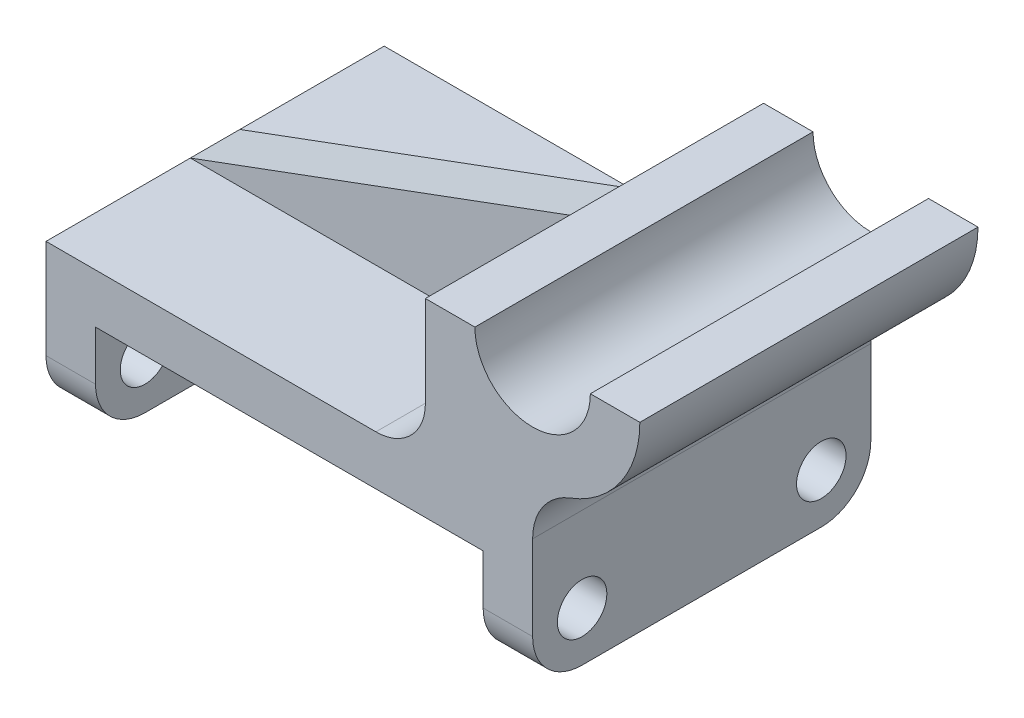
ISO-10303-21;
HEADER;
FILE_DESCRIPTION(('STEP AP214'),'2;1');
FILE_NAME('part.step','',(''),(''),'','','');
FILE_SCHEMA(('AUTOMOTIVE_DESIGN { 1 0 10303 214 1 1 1 1 }'));
ENDSEC;
DATA;
#1=APPLICATION_CONTEXT('core data for automotive mechanical design processes');
#2=APPLICATION_PROTOCOL_DEFINITION('international standard','automotive_design',2000,#1);
#3=PRODUCT_CONTEXT('',#1,'mechanical');
#4=PRODUCT('Part','Part','',(#3));
#5=PRODUCT_RELATED_PRODUCT_CATEGORY('part','',(#4));
#6=PRODUCT_DEFINITION_FORMATION('','',#4);
#7=PRODUCT_DEFINITION_CONTEXT('part definition',#1,'design');
#8=PRODUCT_DEFINITION('design','',#6,#7);
#9=PRODUCT_DEFINITION_SHAPE('','',#8);
#10=(LENGTH_UNIT() NAMED_UNIT(*) SI_UNIT(.MILLI.,.METRE.));
#11=(NAMED_UNIT(*) PLANE_ANGLE_UNIT() SI_UNIT($,.RADIAN.));
#12=(NAMED_UNIT(*) SI_UNIT($,.STERADIAN.) SOLID_ANGLE_UNIT());
#13=UNCERTAINTY_MEASURE_WITH_UNIT(LENGTH_MEASURE(1.E-05),#10,'distance_accuracy_value','');
#14=(GEOMETRIC_REPRESENTATION_CONTEXT(3) GLOBAL_UNCERTAINTY_ASSIGNED_CONTEXT((#13)) GLOBAL_UNIT_ASSIGNED_CONTEXT((#10,
#11,#12)) REPRESENTATION_CONTEXT('',''));
#15=CARTESIAN_POINT('',(0.,0.,0.));
#16=DIRECTION('',(0.,0.,1.));
#17=DIRECTION('',(1.,0.,0.));
#18=AXIS2_PLACEMENT_3D('',#15,#16,#17);
#19=CARTESIAN_POINT('',(92.,0.,41.));
#20=DIRECTION('',(1.,0.,0.));
#21=DIRECTION('',(0.,1.,0.));
#22=AXIS2_PLACEMENT_3D('',#19,#20,#21);
#23=PLANE('',#22);
#24=DIRECTION('',(0.,-1.,0.));
#25=VECTOR('',#24,1.);
#26=CARTESIAN_POINT('',(92.,0.,-6.));
#27=LINE('',#26,#25);
#28=CARTESIAN_POINT('',(92.,41.1151832460733,-6.));
#29=VERTEX_POINT('',#28);
#30=CARTESIAN_POINT('',(92.,19.1151832460733,-6.));
#31=VERTEX_POINT('',#30);
#32=EDGE_CURVE('E349',#29,#31,#27,.T.);
#33=ORIENTED_EDGE('',*,*,#32,.F.);
#34=DIRECTION('',(0.,0.,-1.));
#35=VECTOR('',#34,1.);
#36=CARTESIAN_POINT('',(92.,41.1151832460733,41.));
#37=LINE('',#36,#35);
#38=CARTESIAN_POINT('',(92.,41.1151832460733,-41.));
#39=VERTEX_POINT('',#38);
#40=EDGE_CURVE('E236',#29,#39,#37,.T.);
#41=ORIENTED_EDGE('',*,*,#40,.T.);
#42=DIRECTION('',(0.,-1.,0.));
#43=VECTOR('',#42,1.);
#44=CARTESIAN_POINT('',(92.,0.,-41.));
#45=LINE('',#44,#43);
#46=CARTESIAN_POINT('',(92.,19.1151832460733,-41.));
#47=VERTEX_POINT('',#46);
#48=EDGE_CURVE('E347',#39,#47,#45,.T.);
#49=ORIENTED_EDGE('',*,*,#48,.T.);
#50=DIRECTION('',(0.,0.,-1.));
#51=VECTOR('',#50,1.);
#52=CARTESIAN_POINT('',(92.,19.1151832460733,41.));
#53=LINE('',#52,#51);
#54=EDGE_CURVE('E224',#31,#47,#53,.T.);
#55=ORIENTED_EDGE('',*,*,#54,.F.);
#56=EDGE_LOOP('',(#33,#41,#49,#55));
#57=FACE_BOUND('',#56,.T.);
#58=ADVANCED_FACE('F38',(#57),#23,.F.);
#59=CARTESIAN_POINT('',(80.,19.1151832460733,41.));
#60=DIRECTION('',(0.,0.,-1.));
#61=DIRECTION('',(-1.,0.,0.));
#62=AXIS2_PLACEMENT_3D('',#59,#60,#61);
#63=CYLINDRICAL_SURFACE('',#62,12.);
#64=DIRECTION('',(0.,0.,-1.));
#65=VECTOR('',#64,1.);
#66=CARTESIAN_POINT('',(80.,7.1151832460733,41.));
#67=LINE('',#66,#65);
#68=CARTESIAN_POINT('',(80.,7.1151832460733,-6.));
#69=VERTEX_POINT('',#68);
#70=CARTESIAN_POINT('',(80.,7.1151832460733,-41.));
#71=VERTEX_POINT('',#70);
#72=EDGE_CURVE('E225',#69,#71,#67,.T.);
#73=ORIENTED_EDGE('',*,*,#72,.F.);
#74=CARTESIAN_POINT('',(80.,19.1151832460733,-6.));
#75=DIRECTION('',(0.,0.,1.));
#76=DIRECTION('',(1.,0.,0.));
#77=AXIS2_PLACEMENT_3D('',#74,#75,#76);
#78=CIRCLE('',#77,12.);
#79=EDGE_CURVE('E532',#69,#31,#78,.T.);
#80=ORIENTED_EDGE('',*,*,#79,.T.);
#81=ORIENTED_EDGE('',*,*,#54,.T.);
#82=CARTESIAN_POINT('',(80.,19.1151832460733,-41.));
#83=DIRECTION('',(0.,0.,1.));
#84=DIRECTION('',(1.,0.,0.));
#85=AXIS2_PLACEMENT_3D('',#82,#83,#84);
#86=CIRCLE('',#85,12.);
#87=EDGE_CURVE('E361',#71,#47,#86,.T.);
#88=ORIENTED_EDGE('',*,*,#87,.F.);
#89=EDGE_LOOP('',(#73,#80,#81,#88));
#90=FACE_BOUND('',#89,.T.);
#91=ADVANCED_FACE('F531',(#90),#63,.F.);
#92=CARTESIAN_POINT('',(0.,7.1151832460733,41.));
#93=DIRECTION('',(0.,1.,0.));
#94=DIRECTION('',(0.,0.,1.));
#95=AXIS2_PLACEMENT_3D('',#92,#93,#94);
#96=PLANE('',#95);
#97=DIRECTION('',(0.,0.,-1.));
#98=VECTOR('',#97,1.);
#99=CARTESIAN_POINT('',(0.,7.1151832460733,41.));
#100=LINE('',#99,#98);
#101=CARTESIAN_POINT('',(0.,7.1151832460733,-6.));
#102=VERTEX_POINT('',#101);
#103=CARTESIAN_POINT('',(0.,7.1151832460733,-41.));
#104=VERTEX_POINT('',#103);
#105=EDGE_CURVE('E415',#102,#104,#100,.T.);
#106=ORIENTED_EDGE('',*,*,#105,.F.);
#107=DIRECTION('',(1.,0.,0.));
#108=VECTOR('',#107,1.);
#109=CARTESIAN_POINT('',(0.,7.1151832460733,-6.));
#110=LINE('',#109,#108);
#111=EDGE_CURVE('E528',#102,#69,#110,.T.);
#112=ORIENTED_EDGE('',*,*,#111,.T.);
#113=ORIENTED_EDGE('',*,*,#72,.T.);
#114=DIRECTION('',(1.,0.,0.));
#115=VECTOR('',#114,1.);
#116=CARTESIAN_POINT('',(0.,7.1151832460733,-41.));
#117=LINE('',#116,#115);
#118=EDGE_CURVE('E378',#104,#71,#117,.T.);
#119=ORIENTED_EDGE('',*,*,#118,.F.);
#120=EDGE_LOOP('',(#106,#112,#113,#119));
#121=FACE_BOUND('',#120,.T.);
#122=ADVANCED_FACE('F524',(#121),#96,.T.);
#123=CARTESIAN_POINT('',(118.,0.,41.));
#124=DIRECTION('',(-1.,0.,0.));
#125=DIRECTION('',(0.,0.,1.));
#126=AXIS2_PLACEMENT_3D('',#123,#124,#125);
#127=PLANE('',#126);
#128=CARTESIAN_POINT('',(118.,-16.8848167539267,29.));
#129=DIRECTION('',(-1.,0.,0.));
#130=DIRECTION('',(0.,0.,1.));
#131=AXIS2_PLACEMENT_3D('',#128,#129,#130);
#132=CIRCLE('',#131,6.);
#133=CARTESIAN_POINT('',(118.,-16.8848167539267,35.));
#134=VERTEX_POINT('',#133);
#135=EDGE_CURVE('E540',#134,#134,#132,.T.);
#136=ORIENTED_EDGE('',*,*,#135,.T.);
#137=EDGE_LOOP('',(#136));
#138=FACE_BOUND('',#137,.T.);
#139=CARTESIAN_POINT('',(118.,-16.8848167539267,-29.));
#140=DIRECTION('',(-1.,0.,0.));
#141=DIRECTION('',(0.,0.,1.));
#142=AXIS2_PLACEMENT_3D('',#139,#140,#141);
#143=CIRCLE('',#142,6.);
#144=CARTESIAN_POINT('',(118.,-16.8848167539267,-23.));
#145=VERTEX_POINT('',#144);
#146=EDGE_CURVE('E270',#145,#145,#143,.T.);
#147=ORIENTED_EDGE('',*,*,#146,.T.);
#148=EDGE_LOOP('',(#147));
#149=FACE_BOUND('',#148,.T.);
#150=DIRECTION('',(0.,0.,-1.));
#151=VECTOR('',#150,1.);
#152=CARTESIAN_POINT('',(118.,-28.8848167539267,41.));
#153=LINE('',#152,#151);
#154=CARTESIAN_POINT('',(118.,-28.8848167539267,29.));
#155=VERTEX_POINT('',#154);
#156=CARTESIAN_POINT('',(118.,-28.8848167539267,-29.));
#157=VERTEX_POINT('',#156);
#158=EDGE_CURVE('E395',#155,#157,#153,.T.);
#159=ORIENTED_EDGE('',*,*,#158,.T.);
#160=CARTESIAN_POINT('',(118.,-16.8848167539267,-29.));
#161=DIRECTION('',(-1.,0.,0.));
#162=DIRECTION('',(0.,0.,1.));
#163=AXIS2_PLACEMENT_3D('',#160,#161,#162);
#164=CIRCLE('',#163,12.);
#165=CARTESIAN_POINT('',(118.,-16.8848167539267,-41.));
#166=VERTEX_POINT('',#165);
#167=EDGE_CURVE('E11',#157,#166,#164,.F.);
#168=ORIENTED_EDGE('',*,*,#167,.T.);
#169=DIRECTION('',(0.,1.,0.));
#170=VECTOR('',#169,1.);
#171=CARTESIAN_POINT('',(118.,0.,-41.));
#172=LINE('',#171,#170);
#173=CARTESIAN_POINT('',(118.,3.64519525568294,-41.));
#174=VERTEX_POINT('',#173);
#175=EDGE_CURVE('E458',#166,#174,#172,.T.);
#176=ORIENTED_EDGE('',*,*,#175,.T.);
#177=DIRECTION('',(0.,0.,-1.));
#178=VECTOR('',#177,1.);
#179=CARTESIAN_POINT('',(118.,3.64519525568294,41.));
#180=LINE('',#179,#178);
#181=CARTESIAN_POINT('',(118.,3.64519525568294,41.));
#182=VERTEX_POINT('',#181);
#183=EDGE_CURVE('E254',#182,#174,#180,.T.);
#184=ORIENTED_EDGE('',*,*,#183,.F.);
#185=DIRECTION('',(0.,1.,0.));
#186=VECTOR('',#185,1.);
#187=CARTESIAN_POINT('',(118.,0.,41.));
#188=LINE('',#187,#186);
#189=CARTESIAN_POINT('',(118.,-16.8848167539267,41.));
#190=VERTEX_POINT('',#189);
#191=EDGE_CURVE('E394',#190,#182,#188,.T.);
#192=ORIENTED_EDGE('',*,*,#191,.F.);
#193=CARTESIAN_POINT('',(118.,-16.8848167539267,29.));
#194=DIRECTION('',(-1.,0.,0.));
#195=DIRECTION('',(0.,0.,1.));
#196=AXIS2_PLACEMENT_3D('',#193,#194,#195);
#197=CIRCLE('',#196,12.);
#198=EDGE_CURVE('E47',#190,#155,#197,.F.);
#199=ORIENTED_EDGE('',*,*,#198,.T.);
#200=EDGE_LOOP('',(#159,#168,#176,#184,#192,#199));
#201=FACE_BOUND('',#200,.T.);
#202=ADVANCED_FACE('F641',(#138,#149,#201),#127,.F.);
#203=CARTESIAN_POINT('',(132.,3.64519525568294,41.));
#204=DIRECTION('',(0.,0.,-1.));
#205=DIRECTION('',(-1.,0.,0.));
#206=AXIS2_PLACEMENT_3D('',#203,#204,#205);
#207=CYLINDRICAL_SURFACE('',#206,14.);
#208=CARTESIAN_POINT('',(132.,3.64519525568294,-41.));
#209=DIRECTION('',(0.,0.,1.));
#210=DIRECTION('',(1.,0.,0.));
#211=AXIS2_PLACEMENT_3D('',#208,#209,#210);
#212=CIRCLE('',#211,14.);
#213=CARTESIAN_POINT('',(127.1,16.7596910523196,-41.));
#214=VERTEX_POINT('',#213);
#215=EDGE_CURVE('E461',#174,#214,#212,.F.);
#216=ORIENTED_EDGE('',*,*,#215,.T.);
#217=DIRECTION('',(0.,0.,-1.));
#218=VECTOR('',#217,1.);
#219=CARTESIAN_POINT('',(127.1,16.7596910523196,41.));
#220=LINE('',#219,#218);
#221=CARTESIAN_POINT('',(127.1,16.7596910523196,41.));
#222=VERTEX_POINT('',#221);
#223=EDGE_CURVE('E250',#222,#214,#220,.T.);
#224=ORIENTED_EDGE('',*,*,#223,.F.);
#225=CARTESIAN_POINT('',(132.,3.64519525568294,41.));
#226=DIRECTION('',(0.,0.,1.));
#227=DIRECTION('',(1.,0.,0.));
#228=AXIS2_PLACEMENT_3D('',#225,#226,#227);
#229=CIRCLE('',#228,14.);
#230=EDGE_CURVE('E488',#182,#222,#229,.F.);
#231=ORIENTED_EDGE('',*,*,#230,.F.);
#232=ORIENTED_EDGE('',*,*,#183,.T.);
#233=EDGE_LOOP('',(#216,#224,#231,#232));
#234=FACE_BOUND('',#233,.T.);
#235=ADVANCED_FACE('F487',(#234),#207,.F.);
#236=CARTESIAN_POINT('',(118.,41.1151832460733,41.));
#237=DIRECTION('',(0.,0.,-1.));
#238=DIRECTION('',(-1.,0.,0.));
#239=AXIS2_PLACEMENT_3D('',#236,#237,#238);
#240=CYLINDRICAL_SURFACE('',#239,26.);
#241=CARTESIAN_POINT('',(118.,41.1151832460733,-41.));
#242=DIRECTION('',(0.,0.,1.));
#243=DIRECTION('',(1.,0.,0.));
#244=AXIS2_PLACEMENT_3D('',#241,#242,#243);
#245=CIRCLE('',#244,26.);
#246=CARTESIAN_POINT('',(144.,41.1151832460733,-41.));
#247=VERTEX_POINT('',#246);
#248=EDGE_CURVE('E465',#214,#247,#245,.T.);
#249=ORIENTED_EDGE('',*,*,#248,.T.);
#250=DIRECTION('',(0.,0.,-1.));
#251=VECTOR('',#250,1.);
#252=CARTESIAN_POINT('',(144.,41.1151832460733,41.));
#253=LINE('',#252,#251);
#254=CARTESIAN_POINT('',(144.,41.1151832460733,41.));
#255=VERTEX_POINT('',#254);
#256=EDGE_CURVE('E247',#255,#247,#253,.T.);
#257=ORIENTED_EDGE('',*,*,#256,.F.);
#258=CARTESIAN_POINT('',(118.,41.1151832460733,41.));
#259=DIRECTION('',(0.,0.,1.));
#260=DIRECTION('',(1.,0.,0.));
#261=AXIS2_PLACEMENT_3D('',#258,#259,#260);
#262=CIRCLE('',#261,26.);
#263=EDGE_CURVE('E484',#222,#255,#262,.T.);
#264=ORIENTED_EDGE('',*,*,#263,.F.);
#265=ORIENTED_EDGE('',*,*,#223,.T.);
#266=EDGE_LOOP('',(#249,#257,#264,#265));
#267=FACE_BOUND('',#266,.T.);
#268=ADVANCED_FACE('F482',(#267),#240,.T.);
#269=CARTESIAN_POINT('',(0.,41.1151832460733,41.));
#270=DIRECTION('',(0.,1.,0.));
#271=DIRECTION('',(0.,0.,1.));
#272=AXIS2_PLACEMENT_3D('',#269,#270,#271);
#273=PLANE('',#272);
#274=DIRECTION('',(1.,0.,0.));
#275=VECTOR('',#274,1.);
#276=CARTESIAN_POINT('',(0.,41.1151832460733,-41.));
#277=LINE('',#276,#275);
#278=CARTESIAN_POINT('',(132.,41.1151832460733,-41.));
#279=VERTEX_POINT('',#278);
#280=EDGE_CURVE('E372',#279,#247,#277,.T.);
#281=ORIENTED_EDGE('',*,*,#280,.F.);
#282=DIRECTION('',(0.,0.,-1.));
#283=VECTOR('',#282,1.);
#284=CARTESIAN_POINT('',(132.,41.1151832460733,41.));
#285=LINE('',#284,#283);
#286=CARTESIAN_POINT('',(132.,41.1151832460733,41.));
#287=VERTEX_POINT('',#286);
#288=EDGE_CURVE('E244',#287,#279,#285,.T.);
#289=ORIENTED_EDGE('',*,*,#288,.F.);
#290=DIRECTION('',(1.,0.,0.));
#291=VECTOR('',#290,1.);
#292=CARTESIAN_POINT('',(0.,41.1151832460733,41.));
#293=LINE('',#292,#291);
#294=EDGE_CURVE('E479',#287,#255,#293,.T.);
#295=ORIENTED_EDGE('',*,*,#294,.T.);
#296=ORIENTED_EDGE('',*,*,#256,.T.);
#297=EDGE_LOOP('',(#281,#289,#295,#296));
#298=FACE_BOUND('',#297,.T.);
#299=ADVANCED_FACE('F475',(#298),#273,.T.);
#300=CARTESIAN_POINT('',(118.,41.1151832460733,41.));
#301=DIRECTION('',(0.,0.,-1.));
#302=DIRECTION('',(-1.,0.,0.));
#303=AXIS2_PLACEMENT_3D('',#300,#301,#302);
#304=CYLINDRICAL_SURFACE('',#303,14.);
#305=CARTESIAN_POINT('',(118.,41.1151832460733,-41.));
#306=DIRECTION('',(0.,0.,1.));
#307=DIRECTION('',(1.,0.,0.));
#308=AXIS2_PLACEMENT_3D('',#305,#306,#307);
#309=CIRCLE('',#308,14.);
#310=CARTESIAN_POINT('',(104.,41.1151832460733,-41.));
#311=VERTEX_POINT('',#310);
#312=EDGE_CURVE('E368',#311,#279,#309,.T.);
#313=ORIENTED_EDGE('',*,*,#312,.F.);
#314=DIRECTION('',(0.,0.,-1.));
#315=VECTOR('',#314,1.);
#316=CARTESIAN_POINT('',(104.,41.1151832460733,41.));
#317=LINE('',#316,#315);
#318=CARTESIAN_POINT('',(104.,41.1151832460733,41.));
#319=VERTEX_POINT('',#318);
#320=EDGE_CURVE('E241',#319,#311,#317,.T.);
#321=ORIENTED_EDGE('',*,*,#320,.F.);
#322=CARTESIAN_POINT('',(118.,41.1151832460733,41.));
#323=DIRECTION('',(0.,0.,1.));
#324=DIRECTION('',(1.,0.,0.));
#325=AXIS2_PLACEMENT_3D('',#322,#323,#324);
#326=CIRCLE('',#325,14.);
#327=EDGE_CURVE('E559',#319,#287,#326,.T.);
#328=ORIENTED_EDGE('',*,*,#327,.T.);
#329=ORIENTED_EDGE('',*,*,#288,.T.);
#330=EDGE_LOOP('',(#313,#321,#328,#329));
#331=FACE_BOUND('',#330,.T.);
#332=ADVANCED_FACE('F628',(#331),#304,.F.);
#333=CARTESIAN_POINT('',(0.,41.1151832460733,41.));
#334=DIRECTION('',(0.,1.,0.));
#335=DIRECTION('',(0.,0.,1.));
#336=AXIS2_PLACEMENT_3D('',#333,#334,#335);
#337=PLANE('',#336);
#338=DIRECTION('',(1.,0.,0.));
#339=VECTOR('',#338,1.);
#340=CARTESIAN_POINT('',(0.,41.1151832460733,-41.));
#341=LINE('',#340,#339);
#342=EDGE_CURVE('E358',#39,#311,#341,.T.);
#343=ORIENTED_EDGE('',*,*,#342,.F.);
#344=ORIENTED_EDGE('',*,*,#40,.F.);
#345=DIRECTION('',(0.,0.,-1.));
#346=VECTOR('',#345,1.);
#347=CARTESIAN_POINT('',(92.,41.1151832460733,6.));
#348=LINE('',#347,#346);
#349=CARTESIAN_POINT('',(92.,41.1151832460733,6.));
#350=VERTEX_POINT('',#349);
#351=EDGE_CURVE('E462',#350,#29,#348,.T.);
#352=ORIENTED_EDGE('',*,*,#351,.F.);
#353=CARTESIAN_POINT('',(92.,41.1151832460733,41.));
#354=VERTEX_POINT('',#353);
#355=EDGE_CURVE('E237',#354,#350,#37,.T.);
#356=ORIENTED_EDGE('',*,*,#355,.F.);
#357=DIRECTION('',(1.,0.,0.));
#358=VECTOR('',#357,1.);
#359=CARTESIAN_POINT('',(0.,41.1151832460733,41.));
#360=LINE('',#359,#358);
#361=EDGE_CURVE('E563',#354,#319,#360,.T.);
#362=ORIENTED_EDGE('',*,*,#361,.T.);
#363=ORIENTED_EDGE('',*,*,#320,.T.);
#364=EDGE_LOOP('',(#343,#344,#352,#356,#362,#363));
#365=FACE_BOUND('',#364,.T.);
#366=ADVANCED_FACE('F364',(#365),#337,.T.);
#367=ORIENTED_EDGE('',*,*,#355,.T.);
#368=DIRECTION('',(0.,-1.,0.));
#369=VECTOR('',#368,1.);
#370=CARTESIAN_POINT('',(92.,0.,6.));
#371=LINE('',#370,#369);
#372=CARTESIAN_POINT('',(92.,19.1151832460733,6.));
#373=VERTEX_POINT('',#372);
#374=EDGE_CURVE('E217',#350,#373,#371,.T.);
#375=ORIENTED_EDGE('',*,*,#374,.T.);
#376=CARTESIAN_POINT('',(92.,19.1151832460733,41.));
#377=VERTEX_POINT('',#376);
#378=EDGE_CURVE('E215',#377,#373,#53,.T.);
#379=ORIENTED_EDGE('',*,*,#378,.F.);
#380=DIRECTION('',(0.,-1.,0.));
#381=VECTOR('',#380,1.);
#382=CARTESIAN_POINT('',(92.,0.,41.));
#383=LINE('',#382,#381);
#384=EDGE_CURVE('E445',#354,#377,#383,.T.);
#385=ORIENTED_EDGE('',*,*,#384,.F.);
#386=EDGE_LOOP('',(#367,#375,#379,#385));
#387=FACE_BOUND('',#386,.T.);
#388=ADVANCED_FACE('F571',(#387),#23,.F.);
#389=CARTESIAN_POINT('',(80.,19.1151832460733,6.));
#390=DIRECTION('',(0.,0.,1.));
#391=DIRECTION('',(1.,0.,0.));
#392=AXIS2_PLACEMENT_3D('',#389,#390,#391);
#393=CIRCLE('',#392,12.);
#394=CARTESIAN_POINT('',(80.,7.1151832460733,6.));
#395=VERTEX_POINT('',#394);
#396=EDGE_CURVE('E197',#395,#373,#393,.T.);
#397=ORIENTED_EDGE('',*,*,#396,.F.);
#398=CARTESIAN_POINT('',(80.,7.1151832460733,41.));
#399=VERTEX_POINT('',#398);
#400=EDGE_CURVE('E212',#399,#395,#67,.T.);
#401=ORIENTED_EDGE('',*,*,#400,.F.);
#402=CARTESIAN_POINT('',(80.,19.1151832460733,41.));
#403=DIRECTION('',(0.,0.,1.));
#404=DIRECTION('',(1.,0.,0.));
#405=AXIS2_PLACEMENT_3D('',#402,#403,#404);
#406=CIRCLE('',#405,12.);
#407=EDGE_CURVE('E437',#399,#377,#406,.T.);
#408=ORIENTED_EDGE('',*,*,#407,.T.);
#409=ORIENTED_EDGE('',*,*,#378,.T.);
#410=EDGE_LOOP('',(#397,#401,#408,#409));
#411=FACE_BOUND('',#410,.T.);
#412=ADVANCED_FACE('F210',(#411),#63,.F.);
#413=DIRECTION('',(1.,0.,0.));
#414=VECTOR('',#413,1.);
#415=CARTESIAN_POINT('',(0.,7.1151832460733,6.));
#416=LINE('',#415,#414);
#417=CARTESIAN_POINT('',(0.,7.1151832460733,6.));
#418=VERTEX_POINT('',#417);
#419=EDGE_CURVE('E194',#418,#395,#416,.T.);
#420=ORIENTED_EDGE('',*,*,#419,.F.);
#421=CARTESIAN_POINT('',(0.,7.1151832460733,41.));
#422=VERTEX_POINT('',#421);
#423=EDGE_CURVE('E231',#422,#418,#100,.T.);
#424=ORIENTED_EDGE('',*,*,#423,.F.);
#425=DIRECTION('',(1.,0.,0.));
#426=VECTOR('',#425,1.);
#427=CARTESIAN_POINT('',(0.,7.1151832460733,41.));
#428=LINE('',#427,#426);
#429=EDGE_CURVE('E222',#422,#399,#428,.T.);
#430=ORIENTED_EDGE('',*,*,#429,.T.);
#431=ORIENTED_EDGE('',*,*,#400,.T.);
#432=EDGE_LOOP('',(#420,#424,#430,#431));
#433=FACE_BOUND('',#432,.T.);
#434=ADVANCED_FACE('F220',(#433),#96,.T.);
#435=CARTESIAN_POINT('',(0.,0.,41.));
#436=DIRECTION('',(-1.,0.,0.));
#437=DIRECTION('',(0.,0.,1.));
#438=AXIS2_PLACEMENT_3D('',#435,#436,#437);
#439=PLANE('',#438);
#440=CARTESIAN_POINT('',(0.,-16.8848167539267,29.));
#441=DIRECTION('',(1.,0.,0.));
#442=DIRECTION('',(0.,0.,-1.));
#443=AXIS2_PLACEMENT_3D('',#440,#441,#442);
#444=CIRCLE('',#443,6.);
#445=CARTESIAN_POINT('',(0.,-16.8848167539267,23.));
#446=VERTEX_POINT('',#445);
#447=EDGE_CURVE('E264',#446,#446,#444,.T.);
#448=ORIENTED_EDGE('',*,*,#447,.T.);
#449=EDGE_LOOP('',(#448));
#450=FACE_BOUND('',#449,.T.);
#451=CARTESIAN_POINT('',(0.,-16.8848167539267,-29.));
#452=DIRECTION('',(1.,0.,0.));
#453=DIRECTION('',(0.,0.,1.));
#454=AXIS2_PLACEMENT_3D('',#451,#452,#453);
#455=CIRCLE('',#454,6.);
#456=CARTESIAN_POINT('',(0.,-16.8848167539267,-23.));
#457=VERTEX_POINT('',#456);
#458=EDGE_CURVE('E589',#457,#457,#455,.T.);
#459=ORIENTED_EDGE('',*,*,#458,.T.);
#460=EDGE_LOOP('',(#459));
#461=FACE_BOUND('',#460,.T.);
#462=DIRECTION('',(0.,1.,0.));
#463=VECTOR('',#462,1.);
#464=CARTESIAN_POINT('',(0.,0.,-41.));
#465=LINE('',#464,#463);
#466=CARTESIAN_POINT('',(0.,-16.8848167539267,-41.));
#467=VERTEX_POINT('',#466);
#468=EDGE_CURVE('E381',#467,#104,#465,.T.);
#469=ORIENTED_EDGE('',*,*,#468,.F.);
#470=CARTESIAN_POINT('',(0.,-16.8848167539267,-29.));
#471=DIRECTION('',(-1.,0.,0.));
#472=DIRECTION('',(0.,0.,1.));
#473=AXIS2_PLACEMENT_3D('',#470,#471,#472);
#474=CIRCLE('',#473,12.);
#475=CARTESIAN_POINT('',(0.,-28.8848167539267,-29.));
#476=VERTEX_POINT('',#475);
#477=EDGE_CURVE('E293',#467,#476,#474,.T.);
#478=ORIENTED_EDGE('',*,*,#477,.T.);
#479=DIRECTION('',(0.,0.,-1.));
#480=VECTOR('',#479,1.);
#481=CARTESIAN_POINT('',(0.,-28.8848167539267,41.));
#482=LINE('',#481,#480);
#483=CARTESIAN_POINT('',(0.,-28.8848167539267,29.));
#484=VERTEX_POINT('',#483);
#485=EDGE_CURVE('E412',#484,#476,#482,.T.);
#486=ORIENTED_EDGE('',*,*,#485,.F.);
#487=CARTESIAN_POINT('',(0.,-16.8848167539267,29.));
#488=DIRECTION('',(-1.,0.,0.));
#489=DIRECTION('',(0.,0.,1.));
#490=AXIS2_PLACEMENT_3D('',#487,#488,#489);
#491=CIRCLE('',#490,12.);
#492=CARTESIAN_POINT('',(0.,-16.8848167539267,41.));
#493=VERTEX_POINT('',#492);
#494=EDGE_CURVE('E290',#484,#493,#491,.T.);
#495=ORIENTED_EDGE('',*,*,#494,.T.);
#496=DIRECTION('',(0.,1.,0.));
#497=VECTOR('',#496,1.);
#498=CARTESIAN_POINT('',(0.,0.,41.));
#499=LINE('',#498,#497);
#500=EDGE_CURVE('E433',#493,#422,#499,.T.);
#501=ORIENTED_EDGE('',*,*,#500,.T.);
#502=ORIENTED_EDGE('',*,*,#423,.T.);
#503=DIRECTION('',(0.,0.,-1.));
#504=VECTOR('',#503,1.);
#505=CARTESIAN_POINT('',(0.,7.1151832460733,6.));
#506=LINE('',#505,#504);
#507=EDGE_CURVE('E431',#418,#102,#506,.T.);
#508=ORIENTED_EDGE('',*,*,#507,.T.);
#509=ORIENTED_EDGE('',*,*,#105,.T.);
#510=EDGE_LOOP('',(#469,#478,#486,#495,#501,#502,#508,#509));
#511=FACE_BOUND('',#510,.T.);
#512=ADVANCED_FACE('F430',(#450,#461,#511),#439,.T.);
#513=CARTESIAN_POINT('',(0.,-28.8848167539267,41.));
#514=DIRECTION('',(0.,1.,0.));
#515=DIRECTION('',(-1.,0.,0.));
#516=AXIS2_PLACEMENT_3D('',#513,#514,#515);
#517=PLANE('',#516);
#518=ORIENTED_EDGE('',*,*,#485,.T.);
#519=DIRECTION('',(1.,0.,0.));
#520=VECTOR('',#519,1.);
#521=CARTESIAN_POINT('',(0.,-28.8848167539267,-29.));
#522=LINE('',#521,#520);
#523=CARTESIAN_POINT('',(12.,-28.8848167539267,-29.));
#524=VERTEX_POINT('',#523);
#525=EDGE_CURVE('E273',#476,#524,#522,.T.);
#526=ORIENTED_EDGE('',*,*,#525,.T.);
#527=DIRECTION('',(0.,0.,-1.));
#528=VECTOR('',#527,1.);
#529=CARTESIAN_POINT('',(12.,-28.8848167539267,41.));
#530=LINE('',#529,#528);
#531=CARTESIAN_POINT('',(12.,-28.8848167539267,29.));
#532=VERTEX_POINT('',#531);
#533=EDGE_CURVE('E409',#532,#524,#530,.T.);
#534=ORIENTED_EDGE('',*,*,#533,.F.);
#535=DIRECTION('',(1.,0.,0.));
#536=VECTOR('',#535,1.);
#537=CARTESIAN_POINT('',(0.,-28.8848167539267,29.));
#538=LINE('',#537,#536);
#539=EDGE_CURVE('E258',#532,#484,#538,.F.);
#540=ORIENTED_EDGE('',*,*,#539,.T.);
#541=EDGE_LOOP('',(#518,#526,#534,#540));
#542=FACE_BOUND('',#541,.T.);
#543=ADVANCED_FACE('F518',(#542),#517,.F.);
#544=CARTESIAN_POINT('',(12.,0.,41.));
#545=DIRECTION('',(1.,0.,0.));
#546=DIRECTION('',(0.,1.,0.));
#547=AXIS2_PLACEMENT_3D('',#544,#545,#546);
#548=PLANE('',#547);
#549=CARTESIAN_POINT('',(12.,-16.8848167539267,29.));
#550=DIRECTION('',(1.,0.,0.));
#551=DIRECTION('',(0.,1.,0.));
#552=AXIS2_PLACEMENT_3D('',#549,#550,#551);
#553=CIRCLE('',#552,6.);
#554=CARTESIAN_POINT('',(12.,-10.8848167539267,29.));
#555=VERTEX_POINT('',#554);
#556=EDGE_CURVE('E269',#555,#555,#553,.T.);
#557=ORIENTED_EDGE('',*,*,#556,.F.);
#558=EDGE_LOOP('',(#557));
#559=FACE_BOUND('',#558,.T.);
#560=CARTESIAN_POINT('',(12.,-16.8848167539267,-29.));
#561=DIRECTION('',(1.,0.,0.));
#562=DIRECTION('',(0.,1.,0.));
#563=AXIS2_PLACEMENT_3D('',#560,#561,#562);
#564=CIRCLE('',#563,6.);
#565=CARTESIAN_POINT('',(12.,-10.8848167539267,-29.));
#566=VERTEX_POINT('',#565);
#567=EDGE_CURVE('E263',#566,#566,#564,.T.);
#568=ORIENTED_EDGE('',*,*,#567,.F.);
#569=EDGE_LOOP('',(#568));
#570=FACE_BOUND('',#569,.T.);
#571=ORIENTED_EDGE('',*,*,#533,.T.);
#572=CARTESIAN_POINT('',(12.,-16.8848167539267,-29.));
#573=DIRECTION('',(1.,0.,0.));
#574=DIRECTION('',(0.,1.,0.));
#575=AXIS2_PLACEMENT_3D('',#572,#573,#574);
#576=CIRCLE('',#575,12.);
#577=CARTESIAN_POINT('',(12.,-16.8848167539267,-41.));
#578=VERTEX_POINT('',#577);
#579=EDGE_CURVE('E280',#524,#578,#576,.T.);
#580=ORIENTED_EDGE('',*,*,#579,.T.);
#581=DIRECTION('',(0.,-1.,0.));
#582=VECTOR('',#581,1.);
#583=CARTESIAN_POINT('',(12.,0.,-41.));
#584=LINE('',#583,#582);
#585=CARTESIAN_POINT('',(12.,-4.8848167539267,-41.));
#586=VERTEX_POINT('',#585);
#587=EDGE_CURVE('E384',#586,#578,#584,.T.);
#588=ORIENTED_EDGE('',*,*,#587,.F.);
#589=DIRECTION('',(0.,0.,-1.));
#590=VECTOR('',#589,1.);
#591=CARTESIAN_POINT('',(12.,-4.8848167539267,41.));
#592=LINE('',#591,#590);
#593=CARTESIAN_POINT('',(12.,-4.8848167539267,41.));
#594=VERTEX_POINT('',#593);
#595=EDGE_CURVE('E406',#594,#586,#592,.T.);
#596=ORIENTED_EDGE('',*,*,#595,.F.);
#597=DIRECTION('',(0.,-1.,0.));
#598=VECTOR('',#597,1.);
#599=CARTESIAN_POINT('',(12.,0.,41.));
#600=LINE('',#599,#598);
#601=CARTESIAN_POINT('',(12.,-16.8848167539267,41.));
#602=VERTEX_POINT('',#601);
#603=EDGE_CURVE('E443',#594,#602,#600,.T.);
#604=ORIENTED_EDGE('',*,*,#603,.T.);
#605=CARTESIAN_POINT('',(12.,-16.8848167539267,29.));
#606=DIRECTION('',(1.,0.,0.));
#607=DIRECTION('',(0.,1.,0.));
#608=AXIS2_PLACEMENT_3D('',#605,#606,#607);
#609=CIRCLE('',#608,12.);
#610=EDGE_CURVE('E277',#602,#532,#609,.T.);
#611=ORIENTED_EDGE('',*,*,#610,.T.);
#612=EDGE_LOOP('',(#571,#580,#588,#596,#604,#611));
#613=FACE_BOUND('',#612,.T.);
#614=ADVANCED_FACE('F513',(#559,#570,#613),#548,.T.);
#615=CARTESIAN_POINT('',(0.,-4.8848167539267,41.));
#616=DIRECTION('',(0.,1.,0.));
#617=DIRECTION('',(-1.,0.,0.));
#618=AXIS2_PLACEMENT_3D('',#615,#616,#617);
#619=PLANE('',#618);
#620=DIRECTION('',(1.,0.,0.));
#621=VECTOR('',#620,1.);
#622=CARTESIAN_POINT('',(0.,-4.8848167539267,-41.));
#623=LINE('',#622,#621);
#624=CARTESIAN_POINT('',(106.,-4.8848167539267,-41.));
#625=VERTEX_POINT('',#624);
#626=EDGE_CURVE('E387',#586,#625,#623,.T.);
#627=ORIENTED_EDGE('',*,*,#626,.T.);
#628=DIRECTION('',(0.,0.,-1.));
#629=VECTOR('',#628,1.);
#630=CARTESIAN_POINT('',(106.,-4.8848167539267,41.));
#631=LINE('',#630,#629);
#632=CARTESIAN_POINT('',(106.,-4.8848167539267,41.));
#633=VERTEX_POINT('',#632);
#634=EDGE_CURVE('E402',#633,#625,#631,.T.);
#635=ORIENTED_EDGE('',*,*,#634,.F.);
#636=DIRECTION('',(1.,0.,0.));
#637=VECTOR('',#636,1.);
#638=CARTESIAN_POINT('',(0.,-4.8848167539267,41.));
#639=LINE('',#638,#637);
#640=EDGE_CURVE('E452',#594,#633,#639,.T.);
#641=ORIENTED_EDGE('',*,*,#640,.F.);
#642=ORIENTED_EDGE('',*,*,#595,.T.);
#643=EDGE_LOOP('',(#627,#635,#641,#642));
#644=FACE_BOUND('',#643,.T.);
#645=ADVANCED_FACE('F508',(#644),#619,.F.);
#646=CARTESIAN_POINT('',(106.,0.,41.));
#647=DIRECTION('',(1.,0.,0.));
#648=DIRECTION('',(0.,0.,-1.));
#649=AXIS2_PLACEMENT_3D('',#646,#647,#648);
#650=PLANE('',#649);
#651=CARTESIAN_POINT('',(106.,-16.8848167539267,29.));
#652=DIRECTION('',(1.,0.,0.));
#653=DIRECTION('',(0.,0.,-1.));
#654=AXIS2_PLACEMENT_3D('',#651,#652,#653);
#655=CIRCLE('',#654,6.);
#656=CARTESIAN_POINT('',(106.,-16.8848167539267,23.));
#657=VERTEX_POINT('',#656);
#658=EDGE_CURVE('E265',#657,#657,#655,.T.);
#659=ORIENTED_EDGE('',*,*,#658,.T.);
#660=EDGE_LOOP('',(#659));
#661=FACE_BOUND('',#660,.T.);
#662=CARTESIAN_POINT('',(106.,-16.8848167539267,-29.));
#663=DIRECTION('',(1.,0.,0.));
#664=DIRECTION('',(0.,0.,-1.));
#665=AXIS2_PLACEMENT_3D('',#662,#663,#664);
#666=CIRCLE('',#665,6.);
#667=CARTESIAN_POINT('',(106.,-16.8848167539267,-35.));
#668=VERTEX_POINT('',#667);
#669=EDGE_CURVE('E259',#668,#668,#666,.T.);
#670=ORIENTED_EDGE('',*,*,#669,.T.);
#671=EDGE_LOOP('',(#670));
#672=FACE_BOUND('',#671,.T.);
#673=DIRECTION('',(0.,-1.,0.));
#674=VECTOR('',#673,1.);
#675=CARTESIAN_POINT('',(106.,0.,-41.));
#676=LINE('',#675,#674);
#677=CARTESIAN_POINT('',(106.,-16.8848167539267,-41.));
#678=VERTEX_POINT('',#677);
#679=EDGE_CURVE('E390',#625,#678,#676,.T.);
#680=ORIENTED_EDGE('',*,*,#679,.T.);
#681=CARTESIAN_POINT('',(106.,-16.8848167539267,-29.));
#682=DIRECTION('',(1.,0.,0.));
#683=DIRECTION('',(0.,0.,-1.));
#684=AXIS2_PLACEMENT_3D('',#681,#682,#683);
#685=CIRCLE('',#684,12.);
#686=CARTESIAN_POINT('',(106.,-28.8848167539267,-29.));
#687=VERTEX_POINT('',#686);
#688=EDGE_CURVE('E306',#678,#687,#685,.F.);
#689=ORIENTED_EDGE('',*,*,#688,.T.);
#690=DIRECTION('',(0.,0.,-1.));
#691=VECTOR('',#690,1.);
#692=CARTESIAN_POINT('',(106.,-28.8848167539267,41.));
#693=LINE('',#692,#691);
#694=CARTESIAN_POINT('',(106.,-28.8848167539267,29.));
#695=VERTEX_POINT('',#694);
#696=EDGE_CURVE('E398',#695,#687,#693,.T.);
#697=ORIENTED_EDGE('',*,*,#696,.F.);
#698=CARTESIAN_POINT('',(106.,-16.8848167539267,29.));
#699=DIRECTION('',(1.,0.,0.));
#700=DIRECTION('',(0.,0.,-1.));
#701=AXIS2_PLACEMENT_3D('',#698,#699,#700);
#702=CIRCLE('',#701,12.);
#703=CARTESIAN_POINT('',(106.,-16.8848167539267,41.));
#704=VERTEX_POINT('',#703);
#705=EDGE_CURVE('E303',#695,#704,#702,.F.);
#706=ORIENTED_EDGE('',*,*,#705,.T.);
#707=DIRECTION('',(0.,-1.,0.));
#708=VECTOR('',#707,1.);
#709=CARTESIAN_POINT('',(106.,0.,41.));
#710=LINE('',#709,#708);
#711=EDGE_CURVE('E399',#633,#704,#710,.T.);
#712=ORIENTED_EDGE('',*,*,#711,.F.);
#713=ORIENTED_EDGE('',*,*,#634,.T.);
#714=EDGE_LOOP('',(#680,#689,#697,#706,#712,#713));
#715=FACE_BOUND('',#714,.T.);
#716=ADVANCED_FACE('F498',(#661,#672,#715),#650,.F.);
#717=CARTESIAN_POINT('',(0.,-28.8848167539267,41.));
#718=DIRECTION('',(0.,-1.,0.));
#719=DIRECTION('',(1.,0.,0.));
#720=AXIS2_PLACEMENT_3D('',#717,#718,#719);
#721=PLANE('',#720);
#722=ORIENTED_EDGE('',*,*,#696,.T.);
#723=DIRECTION('',(-1.,0.,0.));
#724=VECTOR('',#723,1.);
#725=CARTESIAN_POINT('',(118.,-28.8848167539267,-29.));
#726=LINE('',#725,#724);
#727=EDGE_CURVE('E54',#687,#157,#726,.F.);
#728=ORIENTED_EDGE('',*,*,#727,.T.);
#729=ORIENTED_EDGE('',*,*,#158,.F.);
#730=DIRECTION('',(-1.,0.,0.));
#731=VECTOR('',#730,1.);
#732=CARTESIAN_POINT('',(0.,-28.8848167539267,29.));
#733=LINE('',#732,#731);
#734=EDGE_CURVE('E309',#155,#695,#733,.T.);
#735=ORIENTED_EDGE('',*,*,#734,.T.);
#736=EDGE_LOOP('',(#722,#728,#729,#735));
#737=FACE_BOUND('',#736,.T.);
#738=ADVANCED_FACE('F499',(#737),#721,.T.);
#739=CARTESIAN_POINT('',(0.,0.,41.));
#740=DIRECTION('',(0.,0.,1.));
#741=DIRECTION('',(1.,0.,0.));
#742=AXIS2_PLACEMENT_3D('',#739,#740,#741);
#743=PLANE('',#742);
#744=ORIENTED_EDGE('',*,*,#500,.F.);
#745=DIRECTION('',(1.,0.,0.));
#746=VECTOR('',#745,1.);
#747=CARTESIAN_POINT('',(12.,-16.8848167539267,41.));
#748=LINE('',#747,#746);
#749=EDGE_CURVE('E299',#493,#602,#748,.T.);
#750=ORIENTED_EDGE('',*,*,#749,.T.);
#751=ORIENTED_EDGE('',*,*,#603,.F.);
#752=ORIENTED_EDGE('',*,*,#640,.T.);
#753=ORIENTED_EDGE('',*,*,#711,.T.);
#754=DIRECTION('',(-1.,0.,0.));
#755=VECTOR('',#754,1.);
#756=CARTESIAN_POINT('',(0.,-16.8848167539267,41.));
#757=LINE('',#756,#755);
#758=EDGE_CURVE('E296',#704,#190,#757,.F.);
#759=ORIENTED_EDGE('',*,*,#758,.T.);
#760=ORIENTED_EDGE('',*,*,#191,.T.);
#761=ORIENTED_EDGE('',*,*,#230,.T.);
#762=ORIENTED_EDGE('',*,*,#263,.T.);
#763=ORIENTED_EDGE('',*,*,#294,.F.);
#764=ORIENTED_EDGE('',*,*,#327,.F.);
#765=ORIENTED_EDGE('',*,*,#361,.F.);
#766=ORIENTED_EDGE('',*,*,#384,.T.);
#767=ORIENTED_EDGE('',*,*,#407,.F.);
#768=ORIENTED_EDGE('',*,*,#429,.F.);
#769=EDGE_LOOP('',(#744,#750,#751,#752,#753,#759,#760,#761,#762,#763,#764,#765,#766,#767,#768));
#770=FACE_BOUND('',#769,.T.);
#771=ADVANCED_FACE('F435',(#770),#743,.T.);
#772=CARTESIAN_POINT('',(0.,0.,-41.));
#773=DIRECTION('',(0.,0.,1.));
#774=DIRECTION('',(1.,0.,0.));
#775=AXIS2_PLACEMENT_3D('',#772,#773,#774);
#776=PLANE('',#775);
#777=ORIENTED_EDGE('',*,*,#587,.T.);
#778=DIRECTION('',(1.,0.,0.));
#779=VECTOR('',#778,1.);
#780=CARTESIAN_POINT('',(0.,-16.8848167539267,-41.));
#781=LINE('',#780,#779);
#782=EDGE_CURVE('E287',#578,#467,#781,.F.);
#783=ORIENTED_EDGE('',*,*,#782,.T.);
#784=ORIENTED_EDGE('',*,*,#468,.T.);
#785=ORIENTED_EDGE('',*,*,#118,.T.);
#786=ORIENTED_EDGE('',*,*,#87,.T.);
#787=ORIENTED_EDGE('',*,*,#48,.F.);
#788=ORIENTED_EDGE('',*,*,#342,.T.);
#789=ORIENTED_EDGE('',*,*,#312,.T.);
#790=ORIENTED_EDGE('',*,*,#280,.T.);
#791=ORIENTED_EDGE('',*,*,#248,.F.);
#792=ORIENTED_EDGE('',*,*,#215,.F.);
#793=ORIENTED_EDGE('',*,*,#175,.F.);
#794=DIRECTION('',(-1.,0.,0.));
#795=VECTOR('',#794,1.);
#796=CARTESIAN_POINT('',(106.,-16.8848167539267,-41.));
#797=LINE('',#796,#795);
#798=EDGE_CURVE('E283',#166,#678,#797,.T.);
#799=ORIENTED_EDGE('',*,*,#798,.T.);
#800=ORIENTED_EDGE('',*,*,#679,.F.);
#801=ORIENTED_EDGE('',*,*,#626,.F.);
#802=EDGE_LOOP('',(#777,#783,#784,#785,#786,#787,#788,#789,#790,#791,#792,#793,#799,#800,#801));
#803=FACE_BOUND('',#802,.T.);
#804=ADVANCED_FACE('F356',(#803),#776,.F.);
#805=CARTESIAN_POINT('',(-2.31354399103091,6.26017785808362,6.));
#806=DIRECTION('',(-0.346650140871629,0.937994498829113,0.));
#807=DIRECTION('',(-0.937994498829113,-0.346650140871629,0.));
#808=AXIS2_PLACEMENT_3D('',#805,#806,#807);
#809=PLANE('',#808);
#810=DIRECTION('',(0.937994498829113,0.346650140871629,0.));
#811=VECTOR('',#810,1.);
#812=CARTESIAN_POINT('',(-2.31354399103091,6.26017785808362,-6.));
#813=LINE('',#812,#811);
#814=EDGE_CURVE('E206',#102,#29,#813,.T.);
#815=ORIENTED_EDGE('',*,*,#814,.F.);
#816=ORIENTED_EDGE('',*,*,#507,.F.);
#817=DIRECTION('',(0.937994498829113,0.346650140871629,0.));
#818=VECTOR('',#817,1.);
#819=CARTESIAN_POINT('',(-2.31354399103091,6.26017785808362,6.));
#820=LINE('',#819,#818);
#821=EDGE_CURVE('E200',#418,#350,#820,.T.);
#822=ORIENTED_EDGE('',*,*,#821,.T.);
#823=ORIENTED_EDGE('',*,*,#351,.T.);
#824=EDGE_LOOP('',(#815,#816,#822,#823));
#825=FACE_BOUND('',#824,.T.);
#826=ADVANCED_FACE('F712',(#825),#809,.T.);
#827=CARTESIAN_POINT('',(0.,0.,6.));
#828=DIRECTION('',(0.,0.,1.));
#829=DIRECTION('',(1.,0.,0.));
#830=AXIS2_PLACEMENT_3D('',#827,#828,#829);
#831=PLANE('',#830);
#832=ORIENTED_EDGE('',*,*,#419,.T.);
#833=ORIENTED_EDGE('',*,*,#396,.T.);
#834=ORIENTED_EDGE('',*,*,#374,.F.);
#835=ORIENTED_EDGE('',*,*,#821,.F.);
#836=EDGE_LOOP('',(#832,#833,#834,#835));
#837=FACE_BOUND('',#836,.T.);
#838=ADVANCED_FACE('F196',(#837),#831,.T.);
#839=CARTESIAN_POINT('',(0.,0.,-6.));
#840=DIRECTION('',(0.,0.,1.));
#841=DIRECTION('',(1.,0.,0.));
#842=AXIS2_PLACEMENT_3D('',#839,#840,#841);
#843=PLANE('',#842);
#844=ORIENTED_EDGE('',*,*,#111,.F.);
#845=ORIENTED_EDGE('',*,*,#814,.T.);
#846=ORIENTED_EDGE('',*,*,#32,.T.);
#847=ORIENTED_EDGE('',*,*,#79,.F.);
#848=EDGE_LOOP('',(#844,#845,#846,#847));
#849=FACE_BOUND('',#848,.T.);
#850=ADVANCED_FACE('F695',(#849),#843,.F.);
#851=CARTESIAN_POINT('',(0.,-16.8848167539267,-29.));
#852=DIRECTION('',(1.,0.,0.));
#853=DIRECTION('',(0.,0.,-1.));
#854=AXIS2_PLACEMENT_3D('',#851,#852,#853);
#855=CYLINDRICAL_SURFACE('',#854,6.);
#856=ORIENTED_EDGE('',*,*,#669,.F.);
#857=EDGE_LOOP('',(#856));
#858=FACE_BOUND('',#857,.T.);
#859=ORIENTED_EDGE('',*,*,#146,.F.);
#860=EDGE_LOOP('',(#859));
#861=FACE_BOUND('',#860,.T.);
#862=ADVANCED_FACE('F613',(#858,#861),#855,.F.);
#863=CARTESIAN_POINT('',(0.,-16.8848167539267,29.));
#864=DIRECTION('',(1.,0.,0.));
#865=DIRECTION('',(0.,0.,-1.));
#866=AXIS2_PLACEMENT_3D('',#863,#864,#865);
#867=CYLINDRICAL_SURFACE('',#866,6.);
#868=ORIENTED_EDGE('',*,*,#658,.F.);
#869=EDGE_LOOP('',(#868));
#870=FACE_BOUND('',#869,.T.);
#871=ORIENTED_EDGE('',*,*,#135,.F.);
#872=EDGE_LOOP('',(#871));
#873=FACE_BOUND('',#872,.T.);
#874=ADVANCED_FACE('F605',(#870,#873),#867,.F.);
#875=ORIENTED_EDGE('',*,*,#567,.T.);
#876=EDGE_LOOP('',(#875));
#877=FACE_BOUND('',#876,.T.);
#878=ORIENTED_EDGE('',*,*,#458,.F.);
#879=EDGE_LOOP('',(#878));
#880=FACE_BOUND('',#879,.T.);
#881=ADVANCED_FACE('F602',(#877,#880),#855,.F.);
#882=ORIENTED_EDGE('',*,*,#556,.T.);
#883=EDGE_LOOP('',(#882));
#884=FACE_BOUND('',#883,.T.);
#885=ORIENTED_EDGE('',*,*,#447,.F.);
#886=EDGE_LOOP('',(#885));
#887=FACE_BOUND('',#886,.T.);
#888=ADVANCED_FACE('F600',(#884,#887),#867,.F.);
#889=CARTESIAN_POINT('',(0.,-16.8848167539267,-29.));
#890=DIRECTION('',(1.,0.,0.));
#891=DIRECTION('',(0.,1.,0.));
#892=AXIS2_PLACEMENT_3D('',#889,#890,#891);
#893=CYLINDRICAL_SURFACE('',#892,12.);
#894=ORIENTED_EDGE('',*,*,#477,.F.);
#895=ORIENTED_EDGE('',*,*,#782,.F.);
#896=ORIENTED_EDGE('',*,*,#579,.F.);
#897=ORIENTED_EDGE('',*,*,#525,.F.);
#898=EDGE_LOOP('',(#894,#895,#896,#897));
#899=FACE_BOUND('',#898,.T.);
#900=ADVANCED_FACE('F517',(#899),#893,.T.);
#901=CARTESIAN_POINT('',(0.,-16.8848167539267,29.));
#902=DIRECTION('',(-1.,0.,0.));
#903=DIRECTION('',(0.,-1.,0.));
#904=AXIS2_PLACEMENT_3D('',#901,#902,#903);
#905=CYLINDRICAL_SURFACE('',#904,12.);
#906=ORIENTED_EDGE('',*,*,#494,.F.);
#907=ORIENTED_EDGE('',*,*,#539,.F.);
#908=ORIENTED_EDGE('',*,*,#610,.F.);
#909=ORIENTED_EDGE('',*,*,#749,.F.);
#910=EDGE_LOOP('',(#906,#907,#908,#909));
#911=FACE_BOUND('',#910,.T.);
#912=ADVANCED_FACE('F522',(#911),#905,.T.);
#913=CARTESIAN_POINT('',(0.,-16.8848167539267,-29.));
#914=DIRECTION('',(1.,0.,0.));
#915=DIRECTION('',(0.,1.,0.));
#916=AXIS2_PLACEMENT_3D('',#913,#914,#915);
#917=CYLINDRICAL_SURFACE('',#916,12.);
#918=ORIENTED_EDGE('',*,*,#167,.F.);
#919=ORIENTED_EDGE('',*,*,#727,.F.);
#920=ORIENTED_EDGE('',*,*,#688,.F.);
#921=ORIENTED_EDGE('',*,*,#798,.F.);
#922=EDGE_LOOP('',(#918,#919,#920,#921));
#923=FACE_BOUND('',#922,.T.);
#924=ADVANCED_FACE('F495',(#923),#917,.T.);
#925=CARTESIAN_POINT('',(0.,-16.8848167539267,29.));
#926=DIRECTION('',(-1.,0.,0.));
#927=DIRECTION('',(0.,-1.,0.));
#928=AXIS2_PLACEMENT_3D('',#925,#926,#927);
#929=CYLINDRICAL_SURFACE('',#928,12.);
#930=ORIENTED_EDGE('',*,*,#198,.F.);
#931=ORIENTED_EDGE('',*,*,#758,.F.);
#932=ORIENTED_EDGE('',*,*,#705,.F.);
#933=ORIENTED_EDGE('',*,*,#734,.F.);
#934=EDGE_LOOP('',(#930,#931,#932,#933));
#935=FACE_BOUND('',#934,.T.);
#936=ADVANCED_FACE('F40',(#935),#929,.T.);
#937=CLOSED_SHELL('',(#58,#91,#122,#202,#235,#268,#299,#332,#366,#388,#412,#434,#512,#543,#614,
#645,#716,#738,#771,#804,#826,#838,#850,#862,#874,#881,#888,#900,#912,#924,#936));
#938=MANIFOLD_SOLID_BREP('B2',#937);
#939=ADVANCED_BREP_SHAPE_REPRESENTATION('',(#18,#938),#14);
#940=SHAPE_DEFINITION_REPRESENTATION(#9,#939);
ENDSEC;
END-ISO-10303-21;
